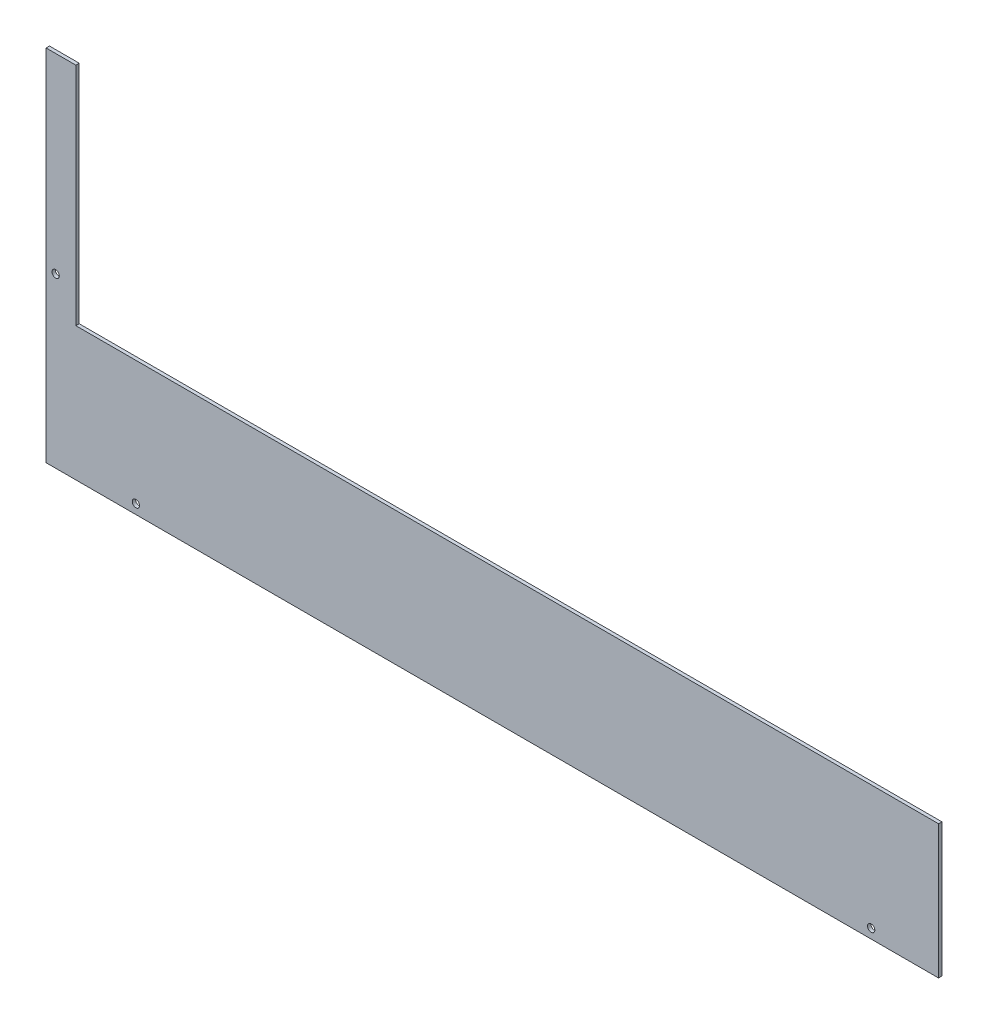
ISO-10303-21;
HEADER;
FILE_DESCRIPTION(('STEP AP214'),'2;1');
FILE_NAME('part.step','',(''),(''),'','','');
FILE_SCHEMA(('AUTOMOTIVE_DESIGN { 1 0 10303 214 1 1 1 1 }'));
ENDSEC;
DATA;
#1=APPLICATION_CONTEXT('core data for automotive mechanical design processes');
#2=APPLICATION_PROTOCOL_DEFINITION('international standard','automotive_design',2000,#1);
#3=PRODUCT_CONTEXT('',#1,'mechanical');
#4=PRODUCT('Part','Part','',(#3));
#5=PRODUCT_RELATED_PRODUCT_CATEGORY('part','',(#4));
#6=PRODUCT_DEFINITION_FORMATION('','',#4);
#7=PRODUCT_DEFINITION_CONTEXT('part definition',#1,'design');
#8=PRODUCT_DEFINITION('design','',#6,#7);
#9=PRODUCT_DEFINITION_SHAPE('','',#8);
#10=(LENGTH_UNIT() NAMED_UNIT(*) SI_UNIT(.MILLI.,.METRE.));
#11=(NAMED_UNIT(*) PLANE_ANGLE_UNIT() SI_UNIT($,.RADIAN.));
#12=(NAMED_UNIT(*) SI_UNIT($,.STERADIAN.) SOLID_ANGLE_UNIT());
#13=UNCERTAINTY_MEASURE_WITH_UNIT(LENGTH_MEASURE(1.E-05),#10,'distance_accuracy_value','');
#14=(GEOMETRIC_REPRESENTATION_CONTEXT(3) GLOBAL_UNCERTAINTY_ASSIGNED_CONTEXT((#13)) GLOBAL_UNIT_ASSIGNED_CONTEXT((#10,
#11,#12)) REPRESENTATION_CONTEXT('',''));
#15=CARTESIAN_POINT('',(0.,0.,0.));
#16=DIRECTION('',(0.,0.,1.));
#17=DIRECTION('',(1.,0.,0.));
#18=AXIS2_PLACEMENT_3D('',#15,#16,#17);
#19=CARTESIAN_POINT('',(0.,0.,3.));
#20=DIRECTION('',(0.,0.,-1.));
#21=DIRECTION('',(-1.,0.,0.));
#22=AXIS2_PLACEMENT_3D('',#19,#20,#21);
#23=PLANE('',#22);
#24=DIRECTION('',(0.,-1.,0.));
#25=VECTOR('',#24,1.);
#26=CARTESIAN_POINT('',(0.,-320.,3.));
#27=LINE('',#26,#25);
#28=CARTESIAN_POINT('',(0.,0.,3.));
#29=VERTEX_POINT('',#28);
#30=CARTESIAN_POINT('',(0.,-320.,3.));
#31=VERTEX_POINT('',#30);
#32=EDGE_CURVE('E152',#29,#31,#27,.T.);
#33=ORIENTED_EDGE('',*,*,#32,.T.);
#34=DIRECTION('',(1.,0.,0.));
#35=VECTOR('',#34,1.);
#36=CARTESIAN_POINT('',(0.,-320.,3.));
#37=LINE('',#36,#35);
#38=CARTESIAN_POINT('',(795.,-320.,3.));
#39=VERTEX_POINT('',#38);
#40=EDGE_CURVE('E100',#31,#39,#37,.T.);
#41=ORIENTED_EDGE('',*,*,#40,.T.);
#42=DIRECTION('',(0.,1.,0.));
#43=VECTOR('',#42,1.);
#44=CARTESIAN_POINT('',(795.,-320.,3.));
#45=LINE('',#44,#43);
#46=CARTESIAN_POINT('',(795.,-201.,3.));
#47=VERTEX_POINT('',#46);
#48=EDGE_CURVE('E113',#39,#47,#45,.T.);
#49=ORIENTED_EDGE('',*,*,#48,.T.);
#50=DIRECTION('',(-1.,0.,0.));
#51=VECTOR('',#50,1.);
#52=CARTESIAN_POINT('',(26.5000000000001,-201.,3.));
#53=LINE('',#52,#51);
#54=CARTESIAN_POINT('',(26.5000000000001,-201.,3.));
#55=VERTEX_POINT('',#54);
#56=EDGE_CURVE('E107',#47,#55,#53,.T.);
#57=ORIENTED_EDGE('',*,*,#56,.T.);
#58=DIRECTION('',(0.,1.,0.));
#59=VECTOR('',#58,1.);
#60=CARTESIAN_POINT('',(26.5000000000001,0.,3.));
#61=LINE('',#60,#59);
#62=CARTESIAN_POINT('',(26.5000000000001,0.,3.));
#63=VERTEX_POINT('',#62);
#64=EDGE_CURVE('E111',#55,#63,#61,.T.);
#65=ORIENTED_EDGE('',*,*,#64,.T.);
#66=DIRECTION('',(-1.,0.,0.));
#67=VECTOR('',#66,1.);
#68=CARTESIAN_POINT('',(0.,0.,3.));
#69=LINE('',#68,#67);
#70=EDGE_CURVE('E63',#63,#29,#69,.T.);
#71=ORIENTED_EDGE('',*,*,#70,.T.);
#72=EDGE_LOOP('',(#33,#41,#49,#57,#65,#71));
#73=FACE_BOUND('',#72,.T.);
#74=CARTESIAN_POINT('',(735.,-311.5,3.));
#75=DIRECTION('',(0.,0.,1.));
#76=DIRECTION('',(1.,0.,0.));
#77=AXIS2_PLACEMENT_3D('',#74,#75,#76);
#78=CIRCLE('',#77,3.24999999999995);
#79=CARTESIAN_POINT('',(738.25,-311.5,3.));
#80=VERTEX_POINT('',#79);
#81=EDGE_CURVE('E140',#80,#80,#78,.T.);
#82=ORIENTED_EDGE('',*,*,#81,.F.);
#83=EDGE_LOOP('',(#82));
#84=FACE_BOUND('',#83,.T.);
#85=CARTESIAN_POINT('',(80.,-311.5,3.));
#86=DIRECTION('',(0.,0.,1.));
#87=DIRECTION('',(1.,0.,0.));
#88=AXIS2_PLACEMENT_3D('',#85,#86,#87);
#89=CIRCLE('',#88,3.25000000000001);
#90=CARTESIAN_POINT('',(83.25,-311.5,3.));
#91=VERTEX_POINT('',#90);
#92=EDGE_CURVE('E212',#91,#91,#89,.T.);
#93=ORIENTED_EDGE('',*,*,#92,.F.);
#94=EDGE_LOOP('',(#93));
#95=FACE_BOUND('',#94,.T.);
#96=CARTESIAN_POINT('',(8.5,-170.,3.));
#97=DIRECTION('',(0.,0.,1.));
#98=DIRECTION('',(1.,0.,0.));
#99=AXIS2_PLACEMENT_3D('',#96,#97,#98);
#100=CIRCLE('',#99,3.25);
#101=CARTESIAN_POINT('',(11.75,-170.,3.));
#102=VERTEX_POINT('',#101);
#103=EDGE_CURVE('E201',#102,#102,#100,.T.);
#104=ORIENTED_EDGE('',*,*,#103,.F.);
#105=EDGE_LOOP('',(#104));
#106=FACE_BOUND('',#105,.T.);
#107=ADVANCED_FACE('F45',(#73,#84,#95,#106),#23,.F.);
#108=CARTESIAN_POINT('',(0.,0.,0.));
#109=DIRECTION('',(0.,0.,-1.));
#110=DIRECTION('',(-1.,0.,0.));
#111=AXIS2_PLACEMENT_3D('',#108,#109,#110);
#112=PLANE('',#111);
#113=CARTESIAN_POINT('',(80.,-311.5,0.));
#114=DIRECTION('',(0.,0.,1.));
#115=DIRECTION('',(1.,0.,0.));
#116=AXIS2_PLACEMENT_3D('',#113,#114,#115);
#117=CIRCLE('',#116,3.25000000000001);
#118=CARTESIAN_POINT('',(83.25,-311.5,0.));
#119=VERTEX_POINT('',#118);
#120=EDGE_CURVE('E209',#119,#119,#117,.T.);
#121=ORIENTED_EDGE('',*,*,#120,.T.);
#122=EDGE_LOOP('',(#121));
#123=FACE_BOUND('',#122,.T.);
#124=DIRECTION('',(0.,-1.,0.));
#125=VECTOR('',#124,1.);
#126=CARTESIAN_POINT('',(0.,-320.,0.));
#127=LINE('',#126,#125);
#128=CARTESIAN_POINT('',(0.,0.,0.));
#129=VERTEX_POINT('',#128);
#130=CARTESIAN_POINT('',(0.,-320.,0.));
#131=VERTEX_POINT('',#130);
#132=EDGE_CURVE('E135',#129,#131,#127,.T.);
#133=ORIENTED_EDGE('',*,*,#132,.F.);
#134=DIRECTION('',(-1.,0.,0.));
#135=VECTOR('',#134,1.);
#136=CARTESIAN_POINT('',(0.,0.,0.));
#137=LINE('',#136,#135);
#138=CARTESIAN_POINT('',(26.5000000000001,0.,0.));
#139=VERTEX_POINT('',#138);
#140=EDGE_CURVE('E92',#139,#129,#137,.T.);
#141=ORIENTED_EDGE('',*,*,#140,.F.);
#142=DIRECTION('',(0.,1.,0.));
#143=VECTOR('',#142,1.);
#144=CARTESIAN_POINT('',(26.5000000000001,0.,0.));
#145=LINE('',#144,#143);
#146=CARTESIAN_POINT('',(26.5000000000001,-201.,0.));
#147=VERTEX_POINT('',#146);
#148=EDGE_CURVE('E86',#147,#139,#145,.T.);
#149=ORIENTED_EDGE('',*,*,#148,.F.);
#150=DIRECTION('',(-1.,0.,0.));
#151=VECTOR('',#150,1.);
#152=CARTESIAN_POINT('',(26.5000000000001,-201.,0.));
#153=LINE('',#152,#151);
#154=CARTESIAN_POINT('',(795.,-201.,0.));
#155=VERTEX_POINT('',#154);
#156=EDGE_CURVE('E122',#155,#147,#153,.T.);
#157=ORIENTED_EDGE('',*,*,#156,.F.);
#158=DIRECTION('',(0.,1.,0.));
#159=VECTOR('',#158,1.);
#160=CARTESIAN_POINT('',(795.,-320.,0.));
#161=LINE('',#160,#159);
#162=CARTESIAN_POINT('',(795.,-320.,0.));
#163=VERTEX_POINT('',#162);
#164=EDGE_CURVE('E143',#163,#155,#161,.T.);
#165=ORIENTED_EDGE('',*,*,#164,.F.);
#166=DIRECTION('',(1.,0.,0.));
#167=VECTOR('',#166,1.);
#168=CARTESIAN_POINT('',(0.,-320.,0.));
#169=LINE('',#168,#167);
#170=EDGE_CURVE('E139',#131,#163,#169,.T.);
#171=ORIENTED_EDGE('',*,*,#170,.F.);
#172=EDGE_LOOP('',(#133,#141,#149,#157,#165,#171));
#173=FACE_BOUND('',#172,.T.);
#174=CARTESIAN_POINT('',(735.,-311.5,0.));
#175=DIRECTION('',(0.,0.,1.));
#176=DIRECTION('',(1.,0.,0.));
#177=AXIS2_PLACEMENT_3D('',#174,#175,#176);
#178=CIRCLE('',#177,3.24999999999995);
#179=CARTESIAN_POINT('',(738.25,-311.5,0.));
#180=VERTEX_POINT('',#179);
#181=EDGE_CURVE('E216',#180,#180,#178,.T.);
#182=ORIENTED_EDGE('',*,*,#181,.T.);
#183=EDGE_LOOP('',(#182));
#184=FACE_BOUND('',#183,.T.);
#185=CARTESIAN_POINT('',(8.5,-170.,0.));
#186=DIRECTION('',(0.,0.,1.));
#187=DIRECTION('',(1.,0.,0.));
#188=AXIS2_PLACEMENT_3D('',#185,#186,#187);
#189=CIRCLE('',#188,3.25);
#190=CARTESIAN_POINT('',(11.75,-170.,0.));
#191=VERTEX_POINT('',#190);
#192=EDGE_CURVE('E204',#191,#191,#189,.T.);
#193=ORIENTED_EDGE('',*,*,#192,.T.);
#194=EDGE_LOOP('',(#193));
#195=FACE_BOUND('',#194,.T.);
#196=ADVANCED_FACE('F165',(#123,#173,#184,#195),#112,.T.);
#197=CARTESIAN_POINT('',(0.,-320.,3.));
#198=DIRECTION('',(1.,0.,0.));
#199=DIRECTION('',(0.,0.,-1.));
#200=AXIS2_PLACEMENT_3D('',#197,#198,#199);
#201=PLANE('',#200);
#202=ORIENTED_EDGE('',*,*,#132,.T.);
#203=DIRECTION('',(0.,0.,-1.));
#204=VECTOR('',#203,1.);
#205=CARTESIAN_POINT('',(0.,-320.,3.));
#206=LINE('',#205,#204);
#207=EDGE_CURVE('E11',#31,#131,#206,.T.);
#208=ORIENTED_EDGE('',*,*,#207,.F.);
#209=ORIENTED_EDGE('',*,*,#32,.F.);
#210=DIRECTION('',(0.,0.,-1.));
#211=VECTOR('',#210,1.);
#212=CARTESIAN_POINT('',(0.,0.,3.));
#213=LINE('',#212,#211);
#214=EDGE_CURVE('E131',#29,#129,#213,.T.);
#215=ORIENTED_EDGE('',*,*,#214,.T.);
#216=EDGE_LOOP('',(#202,#208,#209,#215));
#217=FACE_BOUND('',#216,.T.);
#218=ADVANCED_FACE('F47',(#217),#201,.F.);
#219=CARTESIAN_POINT('',(0.,-320.,3.));
#220=DIRECTION('',(0.,1.,0.));
#221=DIRECTION('',(0.,0.,1.));
#222=AXIS2_PLACEMENT_3D('',#219,#220,#221);
#223=PLANE('',#222);
#224=ORIENTED_EDGE('',*,*,#170,.T.);
#225=DIRECTION('',(0.,0.,-1.));
#226=VECTOR('',#225,1.);
#227=CARTESIAN_POINT('',(795.,-320.,3.));
#228=LINE('',#227,#226);
#229=EDGE_CURVE('E55',#39,#163,#228,.T.);
#230=ORIENTED_EDGE('',*,*,#229,.F.);
#231=ORIENTED_EDGE('',*,*,#40,.F.);
#232=ORIENTED_EDGE('',*,*,#207,.T.);
#233=EDGE_LOOP('',(#224,#230,#231,#232));
#234=FACE_BOUND('',#233,.T.);
#235=ADVANCED_FACE('F276',(#234),#223,.F.);
#236=CARTESIAN_POINT('',(795.,-320.,3.));
#237=DIRECTION('',(-1.,0.,0.));
#238=DIRECTION('',(0.,0.,1.));
#239=AXIS2_PLACEMENT_3D('',#236,#237,#238);
#240=PLANE('',#239);
#241=ORIENTED_EDGE('',*,*,#164,.T.);
#242=DIRECTION('',(0.,0.,-1.));
#243=VECTOR('',#242,1.);
#244=CARTESIAN_POINT('',(795.,-201.,3.));
#245=LINE('',#244,#243);
#246=EDGE_CURVE('E124',#47,#155,#245,.T.);
#247=ORIENTED_EDGE('',*,*,#246,.F.);
#248=ORIENTED_EDGE('',*,*,#48,.F.);
#249=ORIENTED_EDGE('',*,*,#229,.T.);
#250=EDGE_LOOP('',(#241,#247,#248,#249));
#251=FACE_BOUND('',#250,.T.);
#252=ADVANCED_FACE('F162',(#251),#240,.F.);
#253=CARTESIAN_POINT('',(26.5000000000001,-201.,3.));
#254=DIRECTION('',(0.,-1.,0.));
#255=DIRECTION('',(0.,0.,-1.));
#256=AXIS2_PLACEMENT_3D('',#253,#254,#255);
#257=PLANE('',#256);
#258=ORIENTED_EDGE('',*,*,#156,.T.);
#259=DIRECTION('',(0.,0.,-1.));
#260=VECTOR('',#259,1.);
#261=CARTESIAN_POINT('',(26.5000000000001,-201.,3.));
#262=LINE('',#261,#260);
#263=EDGE_CURVE('E119',#55,#147,#262,.T.);
#264=ORIENTED_EDGE('',*,*,#263,.F.);
#265=ORIENTED_EDGE('',*,*,#56,.F.);
#266=ORIENTED_EDGE('',*,*,#246,.T.);
#267=EDGE_LOOP('',(#258,#264,#265,#266));
#268=FACE_BOUND('',#267,.T.);
#269=ADVANCED_FACE('F120',(#268),#257,.F.);
#270=CARTESIAN_POINT('',(26.5000000000001,0.,3.));
#271=DIRECTION('',(-1.,0.,0.));
#272=DIRECTION('',(0.,-1.,0.));
#273=AXIS2_PLACEMENT_3D('',#270,#271,#272);
#274=PLANE('',#273);
#275=ORIENTED_EDGE('',*,*,#148,.T.);
#276=DIRECTION('',(0.,0.,-1.));
#277=VECTOR('',#276,1.);
#278=CARTESIAN_POINT('',(26.5000000000001,0.,3.));
#279=LINE('',#278,#277);
#280=EDGE_CURVE('E125',#63,#139,#279,.T.);
#281=ORIENTED_EDGE('',*,*,#280,.F.);
#282=ORIENTED_EDGE('',*,*,#64,.F.);
#283=ORIENTED_EDGE('',*,*,#263,.T.);
#284=EDGE_LOOP('',(#275,#281,#282,#283));
#285=FACE_BOUND('',#284,.T.);
#286=ADVANCED_FACE('F127',(#285),#274,.F.);
#287=CARTESIAN_POINT('',(0.,0.,3.));
#288=DIRECTION('',(0.,-1.,0.));
#289=DIRECTION('',(0.,0.,-1.));
#290=AXIS2_PLACEMENT_3D('',#287,#288,#289);
#291=PLANE('',#290);
#292=ORIENTED_EDGE('',*,*,#140,.T.);
#293=ORIENTED_EDGE('',*,*,#214,.F.);
#294=ORIENTED_EDGE('',*,*,#70,.F.);
#295=ORIENTED_EDGE('',*,*,#280,.T.);
#296=EDGE_LOOP('',(#292,#293,#294,#295));
#297=FACE_BOUND('',#296,.T.);
#298=ADVANCED_FACE('F170',(#297),#291,.F.);
#299=CARTESIAN_POINT('',(735.,-311.5,3.));
#300=DIRECTION('',(0.,0.,-1.));
#301=DIRECTION('',(-1.,0.,0.));
#302=AXIS2_PLACEMENT_3D('',#299,#300,#301);
#303=CYLINDRICAL_SURFACE('',#302,3.24999999999995);
#304=ORIENTED_EDGE('',*,*,#81,.T.);
#305=EDGE_LOOP('',(#304));
#306=FACE_BOUND('',#305,.T.);
#307=ORIENTED_EDGE('',*,*,#181,.F.);
#308=EDGE_LOOP('',(#307));
#309=FACE_BOUND('',#308,.T.);
#310=ADVANCED_FACE('F172',(#306,#309),#303,.F.);
#311=CARTESIAN_POINT('',(80.,-311.5,3.));
#312=DIRECTION('',(0.,0.,-1.));
#313=DIRECTION('',(-1.,0.,0.));
#314=AXIS2_PLACEMENT_3D('',#311,#312,#313);
#315=CYLINDRICAL_SURFACE('',#314,3.25000000000001);
#316=ORIENTED_EDGE('',*,*,#92,.T.);
#317=EDGE_LOOP('',(#316));
#318=FACE_BOUND('',#317,.T.);
#319=ORIENTED_EDGE('',*,*,#120,.F.);
#320=EDGE_LOOP('',(#319));
#321=FACE_BOUND('',#320,.T.);
#322=ADVANCED_FACE('F178',(#318,#321),#315,.F.);
#323=CARTESIAN_POINT('',(8.5,-170.,3.));
#324=DIRECTION('',(0.,0.,-1.));
#325=DIRECTION('',(-1.,0.,0.));
#326=AXIS2_PLACEMENT_3D('',#323,#324,#325);
#327=CYLINDRICAL_SURFACE('',#326,3.25);
#328=ORIENTED_EDGE('',*,*,#103,.T.);
#329=EDGE_LOOP('',(#328));
#330=FACE_BOUND('',#329,.T.);
#331=ORIENTED_EDGE('',*,*,#192,.F.);
#332=EDGE_LOOP('',(#331));
#333=FACE_BOUND('',#332,.T.);
#334=ADVANCED_FACE('F192',(#330,#333),#327,.F.);
#335=CLOSED_SHELL('',(#107,#196,#218,#235,#252,#269,#286,#298,#310,#322,#334));
#336=MANIFOLD_SOLID_BREP('B2',#335);
#337=ADVANCED_BREP_SHAPE_REPRESENTATION('',(#18,#336),#14);
#338=SHAPE_DEFINITION_REPRESENTATION(#9,#337);
ENDSEC;
END-ISO-10303-21;
